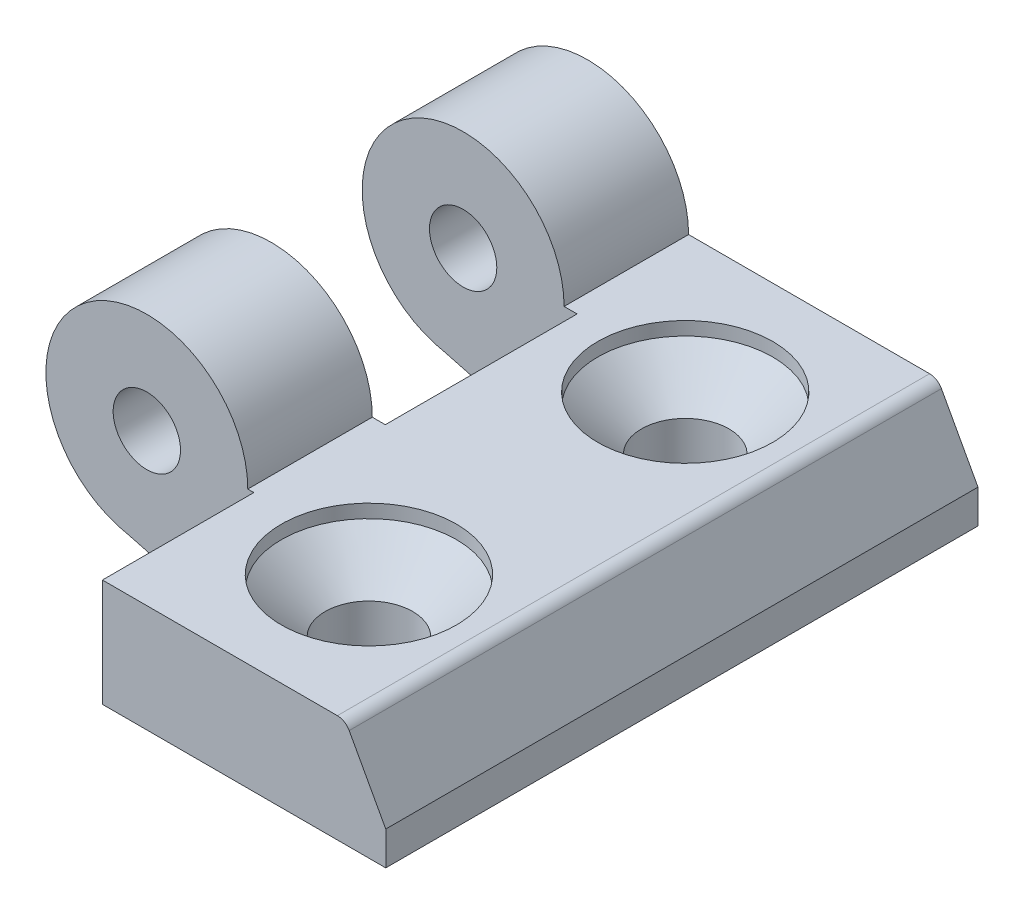
ISO-10303-21;
HEADER;
FILE_DESCRIPTION(('STEP AP214'),'2;1');
FILE_NAME('part.step','',(''),(''),'','','');
FILE_SCHEMA(('AUTOMOTIVE_DESIGN { 1 0 10303 214 1 1 1 1 }'));
ENDSEC;
DATA;
#1=APPLICATION_CONTEXT('core data for automotive mechanical design processes');
#2=APPLICATION_PROTOCOL_DEFINITION('international standard','automotive_design',2000,#1);
#3=PRODUCT_CONTEXT('',#1,'mechanical');
#4=PRODUCT('Part','Part','',(#3));
#5=PRODUCT_RELATED_PRODUCT_CATEGORY('part','',(#4));
#6=PRODUCT_DEFINITION_FORMATION('','',#4);
#7=PRODUCT_DEFINITION_CONTEXT('part definition',#1,'design');
#8=PRODUCT_DEFINITION('design','',#6,#7);
#9=PRODUCT_DEFINITION_SHAPE('','',#8);
#10=(LENGTH_UNIT() NAMED_UNIT(*) SI_UNIT(.MILLI.,.METRE.));
#11=(NAMED_UNIT(*) PLANE_ANGLE_UNIT() SI_UNIT($,.RADIAN.));
#12=(NAMED_UNIT(*) SI_UNIT($,.STERADIAN.) SOLID_ANGLE_UNIT());
#13=UNCERTAINTY_MEASURE_WITH_UNIT(LENGTH_MEASURE(1.E-05),#10,'distance_accuracy_value','');
#14=(GEOMETRIC_REPRESENTATION_CONTEXT(3) GLOBAL_UNCERTAINTY_ASSIGNED_CONTEXT((#13)) GLOBAL_UNIT_ASSIGNED_CONTEXT((#10,
#11,#12)) REPRESENTATION_CONTEXT('',''));
#15=CARTESIAN_POINT('',(0.,0.,0.));
#16=DIRECTION('',(0.,0.,1.));
#17=DIRECTION('',(1.,0.,0.));
#18=AXIS2_PLACEMENT_3D('',#15,#16,#17);
#19=CARTESIAN_POINT('',(0.,0.,22.));
#20=DIRECTION('',(0.,0.,-1.));
#21=DIRECTION('',(-1.,0.,0.));
#22=AXIS2_PLACEMENT_3D('',#19,#20,#21);
#23=CYLINDRICAL_SURFACE('',#22,7.5);
#24=DIRECTION('',(0.,0.,-1.));
#25=VECTOR('',#24,1.);
#26=CARTESIAN_POINT('',(7.5,0.,22.));
#27=LINE('',#26,#25);
#28=CARTESIAN_POINT('',(7.5,0.,10.75));
#29=VERTEX_POINT('',#28);
#30=CARTESIAN_POINT('',(7.5,0.,1.5));
#31=VERTEX_POINT('',#30);
#32=EDGE_CURVE('E245',#29,#31,#27,.T.);
#33=ORIENTED_EDGE('',*,*,#32,.T.);
#34=CARTESIAN_POINT('',(0.,0.,1.5));
#35=DIRECTION('',(0.,0.,1.));
#36=DIRECTION('',(1.,0.,0.));
#37=AXIS2_PLACEMENT_3D('',#34,#35,#36);
#38=CIRCLE('',#37,7.5);
#39=CARTESIAN_POINT('',(-1.3701417354685,-7.37378543386824,1.5));
#40=VERTEX_POINT('',#39);
#41=EDGE_CURVE('E51',#31,#40,#38,.T.);
#42=ORIENTED_EDGE('',*,*,#41,.T.);
#43=DIRECTION('',(0.,0.,-1.));
#44=VECTOR('',#43,1.);
#45=CARTESIAN_POINT('',(-1.3701417354685,-7.37378543386824,22.));
#46=LINE('',#45,#44);
#47=CARTESIAN_POINT('',(-1.3701417354685,-7.37378543386824,10.75));
#48=VERTEX_POINT('',#47);
#49=EDGE_CURVE('E263',#48,#40,#46,.T.);
#50=ORIENTED_EDGE('',*,*,#49,.F.);
#51=CARTESIAN_POINT('',(0.,0.,10.75));
#52=DIRECTION('',(0.,0.,-1.));
#53=DIRECTION('',(-1.,0.,0.));
#54=AXIS2_PLACEMENT_3D('',#51,#52,#53);
#55=CIRCLE('',#54,7.5);
#56=EDGE_CURVE('E187',#48,#29,#55,.T.);
#57=ORIENTED_EDGE('',*,*,#56,.T.);
#58=EDGE_LOOP('',(#33,#42,#50,#57));
#59=FACE_BOUND('',#58,.T.);
#60=ADVANCED_FACE('F35',(#59),#23,.T.);
#61=CARTESIAN_POINT('',(1.,-8.,22.));
#62=DIRECTION('',(0.255444273782313,0.966823780733504,0.));
#63=DIRECTION('',(-0.966823780733504,0.255444273782313,0.));
#64=AXIS2_PLACEMENT_3D('',#61,#62,#63);
#65=PLANE('',#64);
#66=DIRECTION('',(0.,0.,-1.));
#67=VECTOR('',#66,1.);
#68=CARTESIAN_POINT('',(1.,-8.,22.));
#69=LINE('',#68,#67);
#70=CARTESIAN_POINT('',(1.,-8.00000000000001,-12.75));
#71=VERTEX_POINT('',#70);
#72=CARTESIAN_POINT('',(1.,-8.,-22.));
#73=VERTEX_POINT('',#72);
#74=EDGE_CURVE('E260',#71,#73,#69,.T.);
#75=ORIENTED_EDGE('',*,*,#74,.F.);
#76=DIRECTION('',(-0.966823780733504,0.255444273782313,0.));
#77=VECTOR('',#76,1.);
#78=CARTESIAN_POINT('',(1.,-8.,-12.75));
#79=LINE('',#78,#77);
#80=CARTESIAN_POINT('',(-1.3701417354685,-7.37378543386824,-12.75));
#81=VERTEX_POINT('',#80);
#82=EDGE_CURVE('E173',#71,#81,#79,.T.);
#83=ORIENTED_EDGE('',*,*,#82,.T.);
#84=CARTESIAN_POINT('',(-1.3701417354685,-7.37378543386824,-22.));
#85=VERTEX_POINT('',#84);
#86=EDGE_CURVE('E262',#81,#85,#46,.T.);
#87=ORIENTED_EDGE('',*,*,#86,.T.);
#88=DIRECTION('',(0.966823780733504,-0.255444273782313,0.));
#89=VECTOR('',#88,1.);
#90=CARTESIAN_POINT('',(1.,-8.,-22.));
#91=LINE('',#90,#89);
#92=EDGE_CURVE('E232',#85,#73,#91,.T.);
#93=ORIENTED_EDGE('',*,*,#92,.T.);
#94=EDGE_LOOP('',(#75,#83,#87,#93));
#95=FACE_BOUND('',#94,.T.);
#96=ADVANCED_FACE('F279',(#95),#65,.F.);
#97=CARTESIAN_POINT('',(0.,0.,-12.75));
#98=DIRECTION('',(0.,0.,-1.));
#99=DIRECTION('',(-1.,0.,0.));
#100=AXIS2_PLACEMENT_3D('',#97,#98,#99);
#101=CIRCLE('',#100,7.5);
#102=CARTESIAN_POINT('',(7.5,0.,-12.75));
#103=VERTEX_POINT('',#102);
#104=EDGE_CURVE('E171',#81,#103,#101,.T.);
#105=ORIENTED_EDGE('',*,*,#104,.T.);
#106=CARTESIAN_POINT('',(7.5,0.,-22.));
#107=VERTEX_POINT('',#106);
#108=EDGE_CURVE('E229',#103,#107,#27,.T.);
#109=ORIENTED_EDGE('',*,*,#108,.T.);
#110=CARTESIAN_POINT('',(0.,0.,-22.));
#111=DIRECTION('',(0.,0.,1.));
#112=DIRECTION('',(1.,0.,0.));
#113=AXIS2_PLACEMENT_3D('',#110,#111,#112);
#114=CIRCLE('',#113,7.5);
#115=EDGE_CURVE('E216',#107,#85,#114,.T.);
#116=ORIENTED_EDGE('',*,*,#115,.T.);
#117=ORIENTED_EDGE('',*,*,#86,.F.);
#118=EDGE_LOOP('',(#105,#109,#116,#117));
#119=FACE_BOUND('',#118,.T.);
#120=ADVANCED_FACE('F37',(#119),#23,.T.);
#121=ORIENTED_EDGE('',*,*,#49,.T.);
#122=DIRECTION('',(0.966823780733504,-0.255444273782313,0.));
#123=VECTOR('',#122,1.);
#124=CARTESIAN_POINT('',(1.,-8.,1.5));
#125=LINE('',#124,#123);
#126=CARTESIAN_POINT('',(1.,-8.00000000000001,1.5));
#127=VERTEX_POINT('',#126);
#128=EDGE_CURVE('E169',#40,#127,#125,.T.);
#129=ORIENTED_EDGE('',*,*,#128,.T.);
#130=CARTESIAN_POINT('',(1.,-8.00000000000001,10.75));
#131=VERTEX_POINT('',#130);
#132=EDGE_CURVE('E159',#131,#127,#69,.T.);
#133=ORIENTED_EDGE('',*,*,#132,.F.);
#134=DIRECTION('',(-0.966823780733504,0.255444273782313,0.));
#135=VECTOR('',#134,1.);
#136=CARTESIAN_POINT('',(1.,-8.,10.75));
#137=LINE('',#136,#135);
#138=EDGE_CURVE('E189',#131,#48,#137,.T.);
#139=ORIENTED_EDGE('',*,*,#138,.T.);
#140=EDGE_LOOP('',(#121,#129,#133,#139));
#141=FACE_BOUND('',#140,.T.);
#142=ADVANCED_FACE('F301',(#141),#65,.F.);
#143=CARTESIAN_POINT('',(29.,-8.,22.));
#144=DIRECTION('',(0.,1.,0.));
#145=DIRECTION('',(0.,0.,1.));
#146=AXIS2_PLACEMENT_3D('',#143,#144,#145);
#147=PLANE('',#146);
#148=CARTESIAN_POINT('',(17.5000000000001,-8.00000000000001,-11.75));
#149=DIRECTION('',(0.,-1.,0.));
#150=DIRECTION('',(0.,0.,-1.));
#151=AXIS2_PLACEMENT_3D('',#148,#149,#150);
#152=CIRCLE('',#151,3.24999999999998);
#153=CARTESIAN_POINT('',(17.5000000000001,-8.00000000000001,-15.));
#154=VERTEX_POINT('',#153);
#155=EDGE_CURVE('E198',#154,#154,#152,.T.);
#156=ORIENTED_EDGE('',*,*,#155,.F.);
#157=EDGE_LOOP('',(#156));
#158=FACE_BOUND('',#157,.T.);
#159=CARTESIAN_POINT('',(17.5000000000001,-8.00000000000001,11.75));
#160=DIRECTION('',(0.,-1.,0.));
#161=DIRECTION('',(0.,0.,-1.));
#162=AXIS2_PLACEMENT_3D('',#159,#160,#161);
#163=CIRCLE('',#162,3.24999999999998);
#164=CARTESIAN_POINT('',(17.5000000000001,-8.00000000000001,8.50000000000002));
#165=VERTEX_POINT('',#164);
#166=EDGE_CURVE('E210',#165,#165,#163,.T.);
#167=ORIENTED_EDGE('',*,*,#166,.F.);
#168=EDGE_LOOP('',(#167));
#169=FACE_BOUND('',#168,.T.);
#170=DIRECTION('',(0.,0.,-1.));
#171=VECTOR('',#170,1.);
#172=CARTESIAN_POINT('',(8.46621767467225,-8.00000000000001,-12.75));
#173=LINE('',#172,#171);
#174=CARTESIAN_POINT('',(8.46621767467225,-8.00000000000001,1.5));
#175=VERTEX_POINT('',#174);
#176=CARTESIAN_POINT('',(8.46621767467225,-8.00000000000001,-12.75));
#177=VERTEX_POINT('',#176);
#178=EDGE_CURVE('E148',#175,#177,#173,.T.);
#179=ORIENTED_EDGE('',*,*,#178,.T.);
#180=DIRECTION('',(-1.,0.,0.));
#181=VECTOR('',#180,1.);
#182=CARTESIAN_POINT('',(-7.94320775794014,-8.00000000000001,-12.75));
#183=LINE('',#182,#181);
#184=EDGE_CURVE('E145',#177,#71,#183,.T.);
#185=ORIENTED_EDGE('',*,*,#184,.T.);
#186=ORIENTED_EDGE('',*,*,#74,.T.);
#187=DIRECTION('',(1.,0.,0.));
#188=VECTOR('',#187,1.);
#189=CARTESIAN_POINT('',(29.,-8.,-22.));
#190=LINE('',#189,#188);
#191=CARTESIAN_POINT('',(29.,-8.,-22.));
#192=VERTEX_POINT('',#191);
#193=EDGE_CURVE('E235',#73,#192,#190,.T.);
#194=ORIENTED_EDGE('',*,*,#193,.T.);
#195=DIRECTION('',(0.,0.,-1.));
#196=VECTOR('',#195,1.);
#197=CARTESIAN_POINT('',(29.,-8.,22.));
#198=LINE('',#197,#196);
#199=CARTESIAN_POINT('',(29.,-8.,22.));
#200=VERTEX_POINT('',#199);
#201=EDGE_CURVE('E257',#200,#192,#198,.T.);
#202=ORIENTED_EDGE('',*,*,#201,.F.);
#203=DIRECTION('',(1.,0.,0.));
#204=VECTOR('',#203,1.);
#205=CARTESIAN_POINT('',(29.,-8.,22.));
#206=LINE('',#205,#204);
#207=CARTESIAN_POINT('',(7.95139974767027,-8.,22.));
#208=VERTEX_POINT('',#207);
#209=EDGE_CURVE('E217',#208,#200,#206,.T.);
#210=ORIENTED_EDGE('',*,*,#209,.F.);
#211=DIRECTION('',(0.,0.,-1.));
#212=VECTOR('',#211,1.);
#213=CARTESIAN_POINT('',(7.95139974767027,-8.00000000000001,22.));
#214=LINE('',#213,#212);
#215=CARTESIAN_POINT('',(7.95139974767027,-8.00000000000001,10.75));
#216=VERTEX_POINT('',#215);
#217=EDGE_CURVE('E59',#208,#216,#214,.T.);
#218=ORIENTED_EDGE('',*,*,#217,.T.);
#219=DIRECTION('',(-1.,0.,0.));
#220=VECTOR('',#219,1.);
#221=CARTESIAN_POINT('',(-7.94320775794014,-8.00000000000001,10.75));
#222=LINE('',#221,#220);
#223=EDGE_CURVE('E177',#216,#131,#222,.T.);
#224=ORIENTED_EDGE('',*,*,#223,.T.);
#225=ORIENTED_EDGE('',*,*,#132,.T.);
#226=DIRECTION('',(1.,0.,0.));
#227=VECTOR('',#226,1.);
#228=CARTESIAN_POINT('',(-7.94320775794014,-8.00000000000001,1.5));
#229=LINE('',#228,#227);
#230=EDGE_CURVE('E139',#127,#175,#229,.T.);
#231=ORIENTED_EDGE('',*,*,#230,.T.);
#232=EDGE_LOOP('',(#179,#185,#186,#194,#202,#210,#218,#224,#225,#231));
#233=FACE_BOUND('',#232,.T.);
#234=ADVANCED_FACE('F156',(#158,#169,#233),#147,.F.);
#235=CARTESIAN_POINT('',(29.,-5.5,22.));
#236=DIRECTION('',(-1.,0.,0.));
#237=DIRECTION('',(0.,0.,1.));
#238=AXIS2_PLACEMENT_3D('',#235,#236,#237);
#239=PLANE('',#238);
#240=DIRECTION('',(0.,1.,0.));
#241=VECTOR('',#240,1.);
#242=CARTESIAN_POINT('',(29.,-5.5,-22.));
#243=LINE('',#242,#241);
#244=CARTESIAN_POINT('',(29.,-5.5,-22.));
#245=VERTEX_POINT('',#244);
#246=EDGE_CURVE('E237',#192,#245,#243,.T.);
#247=ORIENTED_EDGE('',*,*,#246,.T.);
#248=DIRECTION('',(0.,0.,-1.));
#249=VECTOR('',#248,1.);
#250=CARTESIAN_POINT('',(29.,-5.5,22.));
#251=LINE('',#250,#249);
#252=CARTESIAN_POINT('',(29.,-5.5,22.));
#253=VERTEX_POINT('',#252);
#254=EDGE_CURVE('E254',#253,#245,#251,.T.);
#255=ORIENTED_EDGE('',*,*,#254,.F.);
#256=DIRECTION('',(0.,1.,0.));
#257=VECTOR('',#256,1.);
#258=CARTESIAN_POINT('',(29.,-5.5,22.));
#259=LINE('',#258,#257);
#260=EDGE_CURVE('E219',#200,#253,#259,.T.);
#261=ORIENTED_EDGE('',*,*,#260,.F.);
#262=ORIENTED_EDGE('',*,*,#201,.T.);
#263=EDGE_LOOP('',(#247,#255,#261,#262));
#264=FACE_BOUND('',#263,.T.);
#265=ADVANCED_FACE('F292',(#264),#239,.F.);
#266=CARTESIAN_POINT('',(29.,-5.5,22.));
#267=DIRECTION('',(-0.87789557291435,-0.478852130680636,0.));
#268=DIRECTION('',(0.478852130680636,-0.87789557291435,0.));
#269=AXIS2_PLACEMENT_3D('',#266,#267,#268);
#270=PLANE('',#269);
#271=DIRECTION('',(-0.478852130680636,0.87789557291435,0.));
#272=VECTOR('',#271,1.);
#273=CARTESIAN_POINT('',(29.,-5.5,-22.));
#274=LINE('',#273,#272);
#275=CARTESIAN_POINT('',(26.2842624741738,-0.521147869319435,-22.));
#276=VERTEX_POINT('',#275);
#277=EDGE_CURVE('E239',#245,#276,#274,.T.);
#278=ORIENTED_EDGE('',*,*,#277,.T.);
#279=DIRECTION('',(0.,0.,-1.));
#280=VECTOR('',#279,1.);
#281=CARTESIAN_POINT('',(26.2842624741738,-0.521147869319435,22.));
#282=LINE('',#281,#280);
#283=CARTESIAN_POINT('',(26.2842624741738,-0.521147869319435,22.));
#284=VERTEX_POINT('',#283);
#285=EDGE_CURVE('E251',#284,#276,#282,.T.);
#286=ORIENTED_EDGE('',*,*,#285,.F.);
#287=DIRECTION('',(-0.478852130680636,0.87789557291435,0.));
#288=VECTOR('',#287,1.);
#289=CARTESIAN_POINT('',(29.,-5.5,22.));
#290=LINE('',#289,#288);
#291=EDGE_CURVE('E222',#253,#284,#290,.T.);
#292=ORIENTED_EDGE('',*,*,#291,.F.);
#293=ORIENTED_EDGE('',*,*,#254,.T.);
#294=EDGE_LOOP('',(#278,#286,#292,#293));
#295=FACE_BOUND('',#294,.T.);
#296=ADVANCED_FACE('F337',(#295),#270,.F.);
#297=CARTESIAN_POINT('',(25.4063669012594,-1.,22.));
#298=DIRECTION('',(0.,0.,-1.));
#299=DIRECTION('',(-1.,0.,0.));
#300=AXIS2_PLACEMENT_3D('',#297,#298,#299);
#301=CYLINDRICAL_SURFACE('',#300,1.);
#302=CARTESIAN_POINT('',(25.4063669012594,-1.,-22.));
#303=DIRECTION('',(0.,0.,1.));
#304=DIRECTION('',(1.,0.,0.));
#305=AXIS2_PLACEMENT_3D('',#302,#303,#304);
#306=CIRCLE('',#305,1.);
#307=CARTESIAN_POINT('',(25.4063669012594,0.,-22.));
#308=VERTEX_POINT('',#307);
#309=EDGE_CURVE('E241',#276,#308,#306,.T.);
#310=ORIENTED_EDGE('',*,*,#309,.T.);
#311=DIRECTION('',(0.,0.,-1.));
#312=VECTOR('',#311,1.);
#313=CARTESIAN_POINT('',(25.4063669012594,0.,22.));
#314=LINE('',#313,#312);
#315=CARTESIAN_POINT('',(25.4063669012594,0.,22.));
#316=VERTEX_POINT('',#315);
#317=EDGE_CURVE('E248',#316,#308,#314,.T.);
#318=ORIENTED_EDGE('',*,*,#317,.F.);
#319=CARTESIAN_POINT('',(25.4063669012594,-1.,22.));
#320=DIRECTION('',(0.,0.,1.));
#321=DIRECTION('',(1.,0.,0.));
#322=AXIS2_PLACEMENT_3D('',#319,#320,#321);
#323=CIRCLE('',#322,1.);
#324=EDGE_CURVE('E224',#284,#316,#323,.T.);
#325=ORIENTED_EDGE('',*,*,#324,.F.);
#326=ORIENTED_EDGE('',*,*,#285,.T.);
#327=EDGE_LOOP('',(#310,#318,#325,#326));
#328=FACE_BOUND('',#327,.T.);
#329=ADVANCED_FACE('F335',(#328),#301,.T.);
#330=CARTESIAN_POINT('',(25.4063669012594,0.,22.));
#331=DIRECTION('',(0.,-1.,0.));
#332=DIRECTION('',(0.,0.,-1.));
#333=AXIS2_PLACEMENT_3D('',#330,#331,#332);
#334=PLANE('',#333);
#335=CARTESIAN_POINT('',(17.5000000000001,0.,-11.75));
#336=DIRECTION('',(0.,-1.,0.));
#337=DIRECTION('',(0.,0.,-1.));
#338=AXIS2_PLACEMENT_3D('',#335,#336,#337);
#339=CIRCLE('',#338,6.49999999999995);
#340=CARTESIAN_POINT('',(17.5000000000001,0.,-18.25));
#341=VERTEX_POINT('',#340);
#342=EDGE_CURVE('E201',#341,#341,#339,.T.);
#343=ORIENTED_EDGE('',*,*,#342,.T.);
#344=EDGE_LOOP('',(#343));
#345=FACE_BOUND('',#344,.T.);
#346=CARTESIAN_POINT('',(17.5000000000001,0.,11.75));
#347=DIRECTION('',(0.,-1.,0.));
#348=DIRECTION('',(0.,0.,-1.));
#349=AXIS2_PLACEMENT_3D('',#346,#347,#348);
#350=CIRCLE('',#349,6.49999999999995);
#351=CARTESIAN_POINT('',(17.5000000000001,0.,5.25000000000005));
#352=VERTEX_POINT('',#351);
#353=EDGE_CURVE('E213',#352,#352,#350,.T.);
#354=ORIENTED_EDGE('',*,*,#353,.T.);
#355=EDGE_LOOP('',(#354));
#356=FACE_BOUND('',#355,.T.);
#357=ORIENTED_EDGE('',*,*,#108,.F.);
#358=DIRECTION('',(1.,0.,0.));
#359=VECTOR('',#358,1.);
#360=CARTESIAN_POINT('',(25.4063669012594,0.,-12.75));
#361=LINE('',#360,#359);
#362=CARTESIAN_POINT('',(8.46621767467225,0.,-12.75));
#363=VERTEX_POINT('',#362);
#364=EDGE_CURVE('E11',#103,#363,#361,.T.);
#365=ORIENTED_EDGE('',*,*,#364,.T.);
#366=DIRECTION('',(0.,0.,1.));
#367=VECTOR('',#366,1.);
#368=CARTESIAN_POINT('',(8.46621767467225,0.,22.));
#369=LINE('',#368,#367);
#370=CARTESIAN_POINT('',(8.46621767467225,0.,1.5));
#371=VERTEX_POINT('',#370);
#372=EDGE_CURVE('E44',#363,#371,#369,.T.);
#373=ORIENTED_EDGE('',*,*,#372,.T.);
#374=DIRECTION('',(-1.,0.,0.));
#375=VECTOR('',#374,1.);
#376=CARTESIAN_POINT('',(25.4063669012594,0.,1.5));
#377=LINE('',#376,#375);
#378=EDGE_CURVE('E141',#371,#31,#377,.T.);
#379=ORIENTED_EDGE('',*,*,#378,.T.);
#380=ORIENTED_EDGE('',*,*,#32,.F.);
#381=DIRECTION('',(1.,0.,0.));
#382=VECTOR('',#381,1.);
#383=CARTESIAN_POINT('',(25.4063669012594,0.,10.75));
#384=LINE('',#383,#382);
#385=CARTESIAN_POINT('',(7.95139974767027,0.,10.75));
#386=VERTEX_POINT('',#385);
#387=EDGE_CURVE('E266',#29,#386,#384,.T.);
#388=ORIENTED_EDGE('',*,*,#387,.T.);
#389=DIRECTION('',(0.,0.,1.));
#390=VECTOR('',#389,1.);
#391=CARTESIAN_POINT('',(7.95139974767027,0.,22.));
#392=LINE('',#391,#390);
#393=CARTESIAN_POINT('',(7.95139974767027,0.,22.));
#394=VERTEX_POINT('',#393);
#395=EDGE_CURVE('E183',#386,#394,#392,.T.);
#396=ORIENTED_EDGE('',*,*,#395,.T.);
#397=DIRECTION('',(-1.,0.,0.));
#398=VECTOR('',#397,1.);
#399=CARTESIAN_POINT('',(25.4063669012594,0.,22.));
#400=LINE('',#399,#398);
#401=EDGE_CURVE('E226',#316,#394,#400,.T.);
#402=ORIENTED_EDGE('',*,*,#401,.F.);
#403=ORIENTED_EDGE('',*,*,#317,.T.);
#404=DIRECTION('',(-1.,0.,0.));
#405=VECTOR('',#404,1.);
#406=CARTESIAN_POINT('',(25.4063669012594,0.,-22.));
#407=LINE('',#406,#405);
#408=EDGE_CURVE('E220',#308,#107,#407,.T.);
#409=ORIENTED_EDGE('',*,*,#408,.T.);
#410=EDGE_LOOP('',(#357,#365,#373,#379,#380,#388,#396,#402,#403,#409));
#411=FACE_BOUND('',#410,.T.);
#412=ADVANCED_FACE('F272',(#345,#356,#411),#334,.F.);
#413=CARTESIAN_POINT('',(0.,0.,22.));
#414=DIRECTION('',(0.,0.,1.));
#415=DIRECTION('',(1.,0.,0.));
#416=AXIS2_PLACEMENT_3D('',#413,#414,#415);
#417=PLANE('',#416);
#418=DIRECTION('',(0.,1.,0.));
#419=VECTOR('',#418,1.);
#420=CARTESIAN_POINT('',(7.95139974767027,-8.00000000000001,22.));
#421=LINE('',#420,#419);
#422=EDGE_CURVE('E179',#208,#394,#421,.T.);
#423=ORIENTED_EDGE('',*,*,#422,.F.);
#424=ORIENTED_EDGE('',*,*,#209,.T.);
#425=ORIENTED_EDGE('',*,*,#260,.T.);
#426=ORIENTED_EDGE('',*,*,#291,.T.);
#427=ORIENTED_EDGE('',*,*,#324,.T.);
#428=ORIENTED_EDGE('',*,*,#401,.T.);
#429=EDGE_LOOP('',(#423,#424,#425,#426,#427,#428));
#430=FACE_BOUND('',#429,.T.);
#431=ADVANCED_FACE('F296',(#430),#417,.T.);
#432=CARTESIAN_POINT('',(0.,0.,-22.));
#433=DIRECTION('',(0.,0.,1.));
#434=DIRECTION('',(1.,0.,0.));
#435=AXIS2_PLACEMENT_3D('',#432,#433,#434);
#436=PLANE('',#435);
#437=CARTESIAN_POINT('',(0.,0.,-22.));
#438=DIRECTION('',(0.,0.,1.));
#439=DIRECTION('',(1.,0.,0.));
#440=AXIS2_PLACEMENT_3D('',#437,#438,#439);
#441=CIRCLE('',#440,2.5);
#442=CARTESIAN_POINT('',(2.5,0.,-22.));
#443=VERTEX_POINT('',#442);
#444=EDGE_CURVE('E544',#443,#443,#441,.T.);
#445=ORIENTED_EDGE('',*,*,#444,.T.);
#446=EDGE_LOOP('',(#445));
#447=FACE_BOUND('',#446,.T.);
#448=ORIENTED_EDGE('',*,*,#115,.F.);
#449=ORIENTED_EDGE('',*,*,#408,.F.);
#450=ORIENTED_EDGE('',*,*,#309,.F.);
#451=ORIENTED_EDGE('',*,*,#277,.F.);
#452=ORIENTED_EDGE('',*,*,#246,.F.);
#453=ORIENTED_EDGE('',*,*,#193,.F.);
#454=ORIENTED_EDGE('',*,*,#92,.F.);
#455=EDGE_LOOP('',(#448,#449,#450,#451,#452,#453,#454));
#456=FACE_BOUND('',#455,.T.);
#457=ADVANCED_FACE('F286',(#447,#456),#436,.F.);
#458=CARTESIAN_POINT('',(17.5000000000001,-8.00000000000001,11.75));
#459=DIRECTION('',(0.,-1.,0.));
#460=DIRECTION('',(0.,0.,-1.));
#461=AXIS2_PLACEMENT_3D('',#458,#459,#460);
#462=CYLINDRICAL_SURFACE('',#461,6.49999999999995);
#463=ORIENTED_EDGE('',*,*,#353,.F.);
#464=EDGE_LOOP('',(#463));
#465=FACE_BOUND('',#464,.T.);
#466=CARTESIAN_POINT('',(17.5000000000001,-1.,11.75));
#467=DIRECTION('',(0.,-1.,0.));
#468=DIRECTION('',(0.,0.,-1.));
#469=AXIS2_PLACEMENT_3D('',#466,#467,#468);
#470=CIRCLE('',#469,6.49999999999995);
#471=CARTESIAN_POINT('',(17.5000000000001,-1.,5.25000000000005));
#472=VERTEX_POINT('',#471);
#473=EDGE_CURVE('E204',#472,#472,#470,.T.);
#474=ORIENTED_EDGE('',*,*,#473,.T.);
#475=EDGE_LOOP('',(#474));
#476=FACE_BOUND('',#475,.T.);
#477=ADVANCED_FACE('F360',(#465,#476),#462,.F.);
#478=CARTESIAN_POINT('',(17.5000000000001,-8.00000000000001,11.75));
#479=DIRECTION('',(0.,-1.,0.));
#480=DIRECTION('',(0.,0.,-1.));
#481=AXIS2_PLACEMENT_3D('',#478,#479,#480);
#482=CYLINDRICAL_SURFACE('',#481,3.24999999999998);
#483=CARTESIAN_POINT('',(17.5000000000001,-4.,11.75));
#484=DIRECTION('',(0.,-1.,0.));
#485=DIRECTION('',(0.,0.,-1.));
#486=AXIS2_PLACEMENT_3D('',#483,#484,#485);
#487=CIRCLE('',#486,3.24999999999998);
#488=CARTESIAN_POINT('',(17.5000000000001,-4.,8.50000000000002));
#489=VERTEX_POINT('',#488);
#490=EDGE_CURVE('E207',#489,#489,#487,.T.);
#491=ORIENTED_EDGE('',*,*,#490,.F.);
#492=EDGE_LOOP('',(#491));
#493=FACE_BOUND('',#492,.T.);
#494=ORIENTED_EDGE('',*,*,#166,.T.);
#495=EDGE_LOOP('',(#494));
#496=FACE_BOUND('',#495,.T.);
#497=ADVANCED_FACE('F357',(#493,#496),#482,.F.);
#498=CARTESIAN_POINT('',(17.5000000000001,-4.,11.75));
#499=DIRECTION('',(0.,1.,0.));
#500=DIRECTION('',(0.,0.,1.));
#501=AXIS2_PLACEMENT_3D('',#498,#499,#500);
#502=CONICAL_SURFACE('',#501,3.24999999999998,0.825376850520734);
#503=ORIENTED_EDGE('',*,*,#473,.F.);
#504=EDGE_LOOP('',(#503));
#505=FACE_BOUND('',#504,.T.);
#506=ORIENTED_EDGE('',*,*,#490,.T.);
#507=EDGE_LOOP('',(#506));
#508=FACE_BOUND('',#507,.T.);
#509=ADVANCED_FACE('F359',(#505,#508),#502,.F.);
#510=CARTESIAN_POINT('',(17.5000000000001,-8.00000000000001,-11.75));
#511=DIRECTION('',(0.,-1.,0.));
#512=DIRECTION('',(0.,0.,-1.));
#513=AXIS2_PLACEMENT_3D('',#510,#511,#512);
#514=CYLINDRICAL_SURFACE('',#513,6.49999999999995);
#515=ORIENTED_EDGE('',*,*,#342,.F.);
#516=EDGE_LOOP('',(#515));
#517=FACE_BOUND('',#516,.T.);
#518=CARTESIAN_POINT('',(17.5000000000001,-1.,-11.75));
#519=DIRECTION('',(0.,-1.,0.));
#520=DIRECTION('',(0.,0.,-1.));
#521=AXIS2_PLACEMENT_3D('',#518,#519,#520);
#522=CIRCLE('',#521,6.49999999999995);
#523=CARTESIAN_POINT('',(17.5000000000001,-1.,-18.25));
#524=VERTEX_POINT('',#523);
#525=EDGE_CURVE('E192',#524,#524,#522,.T.);
#526=ORIENTED_EDGE('',*,*,#525,.T.);
#527=EDGE_LOOP('',(#526));
#528=FACE_BOUND('',#527,.T.);
#529=ADVANCED_FACE('F367',(#517,#528),#514,.F.);
#530=CARTESIAN_POINT('',(17.5000000000001,-8.00000000000001,-11.75));
#531=DIRECTION('',(0.,-1.,0.));
#532=DIRECTION('',(0.,0.,-1.));
#533=AXIS2_PLACEMENT_3D('',#530,#531,#532);
#534=CYLINDRICAL_SURFACE('',#533,3.24999999999998);
#535=CARTESIAN_POINT('',(17.5000000000001,-4.,-11.75));
#536=DIRECTION('',(0.,-1.,0.));
#537=DIRECTION('',(0.,0.,-1.));
#538=AXIS2_PLACEMENT_3D('',#535,#536,#537);
#539=CIRCLE('',#538,3.24999999999998);
#540=CARTESIAN_POINT('',(17.5000000000001,-4.,-15.));
#541=VERTEX_POINT('',#540);
#542=EDGE_CURVE('E195',#541,#541,#539,.T.);
#543=ORIENTED_EDGE('',*,*,#542,.F.);
#544=EDGE_LOOP('',(#543));
#545=FACE_BOUND('',#544,.T.);
#546=ORIENTED_EDGE('',*,*,#155,.T.);
#547=EDGE_LOOP('',(#546));
#548=FACE_BOUND('',#547,.T.);
#549=ADVANCED_FACE('F391',(#545,#548),#534,.F.);
#550=CARTESIAN_POINT('',(17.5000000000001,-4.,-11.75));
#551=DIRECTION('',(0.,1.,0.));
#552=DIRECTION('',(0.,0.,1.));
#553=AXIS2_PLACEMENT_3D('',#550,#551,#552);
#554=CONICAL_SURFACE('',#553,3.24999999999998,0.825376850520734);
#555=ORIENTED_EDGE('',*,*,#525,.F.);
#556=EDGE_LOOP('',(#555));
#557=FACE_BOUND('',#556,.T.);
#558=ORIENTED_EDGE('',*,*,#542,.T.);
#559=EDGE_LOOP('',(#558));
#560=FACE_BOUND('',#559,.T.);
#561=ADVANCED_FACE('F316',(#557,#560),#554,.F.);
#562=CARTESIAN_POINT('',(-7.94320775794014,-8.00000000000001,10.75));
#563=DIRECTION('',(0.,0.,-1.));
#564=DIRECTION('',(-1.,0.,0.));
#565=AXIS2_PLACEMENT_3D('',#562,#563,#564);
#566=PLANE('',#565);
#567=CARTESIAN_POINT('',(0.,0.,10.75));
#568=DIRECTION('',(0.,0.,1.));
#569=DIRECTION('',(1.,0.,0.));
#570=AXIS2_PLACEMENT_3D('',#567,#568,#569);
#571=CIRCLE('',#570,2.5);
#572=CARTESIAN_POINT('',(2.5,0.,10.75));
#573=VERTEX_POINT('',#572);
#574=EDGE_CURVE('E546',#573,#573,#571,.T.);
#575=ORIENTED_EDGE('',*,*,#574,.F.);
#576=EDGE_LOOP('',(#575));
#577=FACE_BOUND('',#576,.T.);
#578=ORIENTED_EDGE('',*,*,#223,.F.);
#579=DIRECTION('',(0.,1.,0.));
#580=VECTOR('',#579,1.);
#581=CARTESIAN_POINT('',(7.95139974767027,-8.00000000000001,10.75));
#582=LINE('',#581,#580);
#583=EDGE_CURVE('E180',#216,#386,#582,.T.);
#584=ORIENTED_EDGE('',*,*,#583,.T.);
#585=ORIENTED_EDGE('',*,*,#387,.F.);
#586=ORIENTED_EDGE('',*,*,#56,.F.);
#587=ORIENTED_EDGE('',*,*,#138,.F.);
#588=EDGE_LOOP('',(#578,#584,#585,#586,#587));
#589=FACE_BOUND('',#588,.T.);
#590=ADVANCED_FACE('F306',(#577,#589),#566,.F.);
#591=CARTESIAN_POINT('',(7.95139974767027,-8.00000000000001,22.));
#592=DIRECTION('',(1.,0.,0.));
#593=DIRECTION('',(0.,0.,-1.));
#594=AXIS2_PLACEMENT_3D('',#591,#592,#593);
#595=PLANE('',#594);
#596=ORIENTED_EDGE('',*,*,#583,.F.);
#597=ORIENTED_EDGE('',*,*,#217,.F.);
#598=ORIENTED_EDGE('',*,*,#422,.T.);
#599=ORIENTED_EDGE('',*,*,#395,.F.);
#600=EDGE_LOOP('',(#596,#597,#598,#599));
#601=FACE_BOUND('',#600,.T.);
#602=ADVANCED_FACE('F307',(#601),#595,.F.);
#603=CARTESIAN_POINT('',(-7.94320775794014,-8.00000000000001,-12.75));
#604=DIRECTION('',(0.,0.,-1.));
#605=DIRECTION('',(-1.,0.,0.));
#606=AXIS2_PLACEMENT_3D('',#603,#604,#605);
#607=PLANE('',#606);
#608=CARTESIAN_POINT('',(0.,0.,-12.75));
#609=DIRECTION('',(0.,0.,-1.));
#610=DIRECTION('',(-1.,0.,0.));
#611=AXIS2_PLACEMENT_3D('',#608,#609,#610);
#612=CIRCLE('',#611,2.5);
#613=CARTESIAN_POINT('',(-2.5,0.,-12.75));
#614=VERTEX_POINT('',#613);
#615=EDGE_CURVE('E160',#614,#614,#612,.T.);
#616=ORIENTED_EDGE('',*,*,#615,.T.);
#617=EDGE_LOOP('',(#616));
#618=FACE_BOUND('',#617,.T.);
#619=ORIENTED_EDGE('',*,*,#184,.F.);
#620=DIRECTION('',(0.,1.,0.));
#621=VECTOR('',#620,1.);
#622=CARTESIAN_POINT('',(8.46621767467225,-8.00000000000001,-12.75));
#623=LINE('',#622,#621);
#624=EDGE_CURVE('E144',#177,#363,#623,.T.);
#625=ORIENTED_EDGE('',*,*,#624,.T.);
#626=ORIENTED_EDGE('',*,*,#364,.F.);
#627=ORIENTED_EDGE('',*,*,#104,.F.);
#628=ORIENTED_EDGE('',*,*,#82,.F.);
#629=EDGE_LOOP('',(#619,#625,#626,#627,#628));
#630=FACE_BOUND('',#629,.T.);
#631=ADVANCED_FACE('F276',(#618,#630),#607,.F.);
#632=CARTESIAN_POINT('',(8.46621767467225,-8.00000000000001,-12.75));
#633=DIRECTION('',(1.,0.,0.));
#634=DIRECTION('',(0.,0.,-1.));
#635=AXIS2_PLACEMENT_3D('',#632,#633,#634);
#636=PLANE('',#635);
#637=ORIENTED_EDGE('',*,*,#624,.F.);
#638=ORIENTED_EDGE('',*,*,#178,.F.);
#639=DIRECTION('',(0.,1.,0.));
#640=VECTOR('',#639,1.);
#641=CARTESIAN_POINT('',(8.46621767467225,-8.00000000000001,1.5));
#642=LINE('',#641,#640);
#643=EDGE_CURVE('E135',#175,#371,#642,.T.);
#644=ORIENTED_EDGE('',*,*,#643,.T.);
#645=ORIENTED_EDGE('',*,*,#372,.F.);
#646=EDGE_LOOP('',(#637,#638,#644,#645));
#647=FACE_BOUND('',#646,.T.);
#648=ADVANCED_FACE('F149',(#647),#636,.F.);
#649=CARTESIAN_POINT('',(-7.94320775794014,-8.00000000000001,1.5));
#650=DIRECTION('',(0.,0.,1.));
#651=DIRECTION('',(1.,0.,0.));
#652=AXIS2_PLACEMENT_3D('',#649,#650,#651);
#653=PLANE('',#652);
#654=CARTESIAN_POINT('',(0.,0.,1.5));
#655=DIRECTION('',(0.,0.,1.));
#656=DIRECTION('',(1.,0.,0.));
#657=AXIS2_PLACEMENT_3D('',#654,#655,#656);
#658=CIRCLE('',#657,2.5);
#659=CARTESIAN_POINT('',(2.5,0.,1.5));
#660=VERTEX_POINT('',#659);
#661=EDGE_CURVE('E39',#660,#660,#658,.T.);
#662=ORIENTED_EDGE('',*,*,#661,.T.);
#663=EDGE_LOOP('',(#662));
#664=FACE_BOUND('',#663,.T.);
#665=ORIENTED_EDGE('',*,*,#41,.F.);
#666=ORIENTED_EDGE('',*,*,#378,.F.);
#667=ORIENTED_EDGE('',*,*,#643,.F.);
#668=ORIENTED_EDGE('',*,*,#230,.F.);
#669=ORIENTED_EDGE('',*,*,#128,.F.);
#670=EDGE_LOOP('',(#665,#666,#667,#668,#669));
#671=FACE_BOUND('',#670,.T.);
#672=ADVANCED_FACE('F137',(#664,#671),#653,.F.);
#673=CARTESIAN_POINT('',(0.,0.,-22.));
#674=DIRECTION('',(0.,0.,1.));
#675=DIRECTION('',(1.,0.,0.));
#676=AXIS2_PLACEMENT_3D('',#673,#674,#675);
#677=CYLINDRICAL_SURFACE('',#676,2.5);
#678=ORIENTED_EDGE('',*,*,#574,.T.);
#679=EDGE_LOOP('',(#678));
#680=FACE_BOUND('',#679,.T.);
#681=ORIENTED_EDGE('',*,*,#661,.F.);
#682=EDGE_LOOP('',(#681));
#683=FACE_BOUND('',#682,.T.);
#684=ADVANCED_FACE('F442',(#680,#683),#677,.F.);
#685=ORIENTED_EDGE('',*,*,#444,.F.);
#686=EDGE_LOOP('',(#685));
#687=FACE_BOUND('',#686,.T.);
#688=ORIENTED_EDGE('',*,*,#615,.F.);
#689=EDGE_LOOP('',(#688));
#690=FACE_BOUND('',#689,.T.);
#691=ADVANCED_FACE('F452',(#687,#690),#677,.F.);
#692=CLOSED_SHELL('',(#60,#96,#120,#142,#234,#265,#296,#329,#412,#431,#457,#477,#497,#509,#529,
#549,#561,#590,#602,#631,#648,#672,#684,#691));
#693=MANIFOLD_SOLID_BREP('B2',#692);
#694=ADVANCED_BREP_SHAPE_REPRESENTATION('',(#18,#693),#14);
#695=SHAPE_DEFINITION_REPRESENTATION(#9,#694);
ENDSEC;
END-ISO-10303-21;
